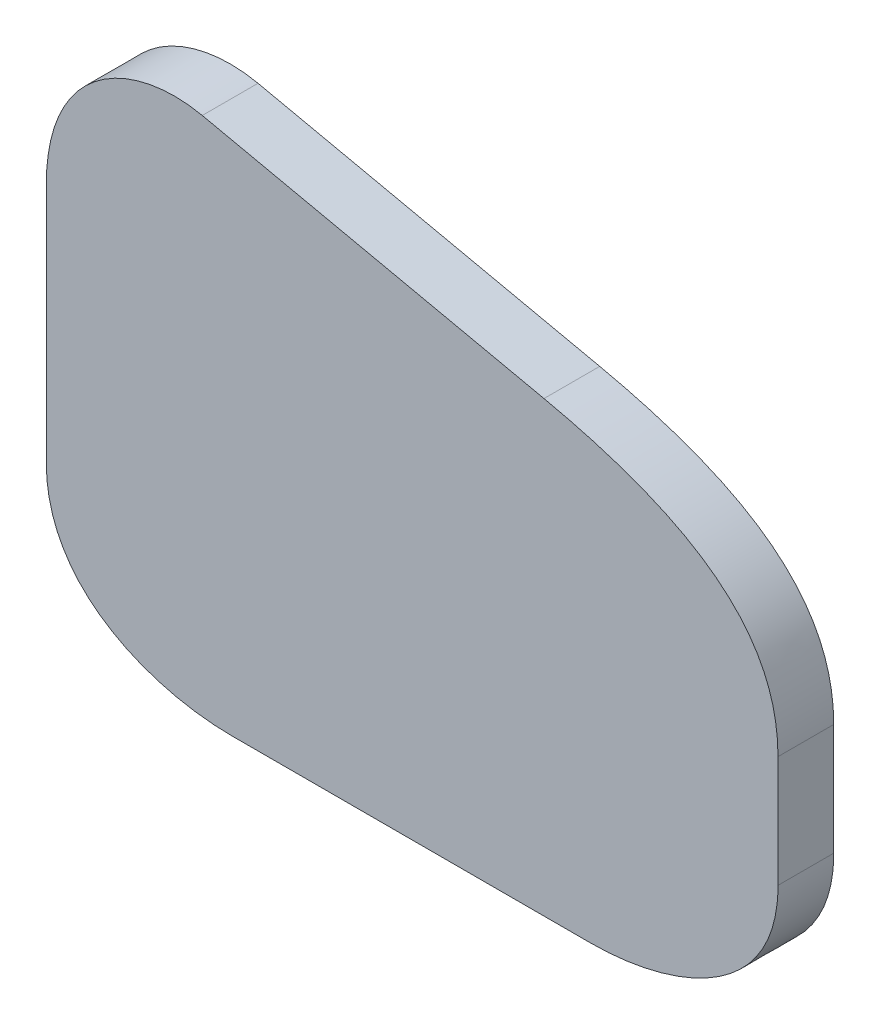
ISO-10303-21;
HEADER;
FILE_DESCRIPTION(('STEP AP214'),'2;1');
FILE_NAME('part.step','',(''),(''),'','','');
FILE_SCHEMA(('AUTOMOTIVE_DESIGN { 1 0 10303 214 1 1 1 1 }'));
ENDSEC;
DATA;
#1=APPLICATION_CONTEXT('core data for automotive mechanical design processes');
#2=APPLICATION_PROTOCOL_DEFINITION('international standard','automotive_design',2000,#1);
#3=PRODUCT_CONTEXT('',#1,'mechanical');
#4=PRODUCT('Part','Part','',(#3));
#5=PRODUCT_RELATED_PRODUCT_CATEGORY('part','',(#4));
#6=PRODUCT_DEFINITION_FORMATION('','',#4);
#7=PRODUCT_DEFINITION_CONTEXT('part definition',#1,'design');
#8=PRODUCT_DEFINITION('design','',#6,#7);
#9=PRODUCT_DEFINITION_SHAPE('','',#8);
#10=(LENGTH_UNIT() NAMED_UNIT(*) SI_UNIT(.MILLI.,.METRE.));
#11=(NAMED_UNIT(*) PLANE_ANGLE_UNIT() SI_UNIT($,.RADIAN.));
#12=(NAMED_UNIT(*) SI_UNIT($,.STERADIAN.) SOLID_ANGLE_UNIT());
#13=UNCERTAINTY_MEASURE_WITH_UNIT(LENGTH_MEASURE(1.E-05),#10,'distance_accuracy_value','');
#14=(GEOMETRIC_REPRESENTATION_CONTEXT(3) GLOBAL_UNCERTAINTY_ASSIGNED_CONTEXT((#13)) GLOBAL_UNIT_ASSIGNED_CONTEXT((#10,
#11,#12)) REPRESENTATION_CONTEXT('',''));
#15=CARTESIAN_POINT('',(0.,0.,0.));
#16=DIRECTION('',(0.,0.,1.));
#17=DIRECTION('',(1.,0.,0.));
#18=AXIS2_PLACEMENT_3D('',#15,#16,#17);
#19=CARTESIAN_POINT('',(-33.5451291028447,-25.7697680525164,10.));
#20=CARTESIAN_POINT('',(-19.4448665678301,-25.7697680525164,10.));
#21=CARTESIAN_POINT('',(0.,-19.0637574545764,10.));
#22=CARTESIAN_POINT('',(0.,0.,10.));
#23=B_SPLINE_CURVE_WITH_KNOTS('',3,(#19,#20,#21,#22),.UNSPECIFIED.,.F.,.F.,(4,4),(0.,1.),.UNSPECIFIED.);
#24=DIRECTION('',(0.,0.,-1.));
#25=VECTOR('',#24,1.);
#26=SURFACE_OF_LINEAR_EXTRUSION('',#23,#25);
#27=CARTESIAN_POINT('',(-33.5451291028447,-25.7697680525164,0.));
#28=CARTESIAN_POINT('',(-19.4448665678301,-25.7697680525164,0.));
#29=CARTESIAN_POINT('',(0.,-19.0637574545764,0.));
#30=CARTESIAN_POINT('',(0.,0.,0.));
#31=B_SPLINE_CURVE_WITH_KNOTS('',3,(#27,#28,#29,#30),.UNSPECIFIED.,.F.,.F.,(4,4),(0.,1.),.UNSPECIFIED.);
#32=CARTESIAN_POINT('',(-33.5451291028447,-25.7697680525164,0.));
#33=VERTEX_POINT('',#32);
#34=CARTESIAN_POINT('',(0.,0.,0.));
#35=VERTEX_POINT('',#34);
#36=EDGE_CURVE('E189',#33,#35,#31,.T.);
#37=ORIENTED_EDGE('',*,*,#36,.T.);
#38=DIRECTION('',(0.,0.,-1.));
#39=VECTOR('',#38,1.);
#40=CARTESIAN_POINT('',(0.,0.,10.));
#41=LINE('',#40,#39);
#42=CARTESIAN_POINT('',(0.,0.,10.));
#43=VERTEX_POINT('',#42);
#44=EDGE_CURVE('E11',#43,#35,#41,.T.);
#45=ORIENTED_EDGE('',*,*,#44,.F.);
#46=CARTESIAN_POINT('',(-33.5451291028447,-25.7697680525164,10.));
#47=VERTEX_POINT('',#46);
#48=EDGE_CURVE('E221',#47,#43,#23,.T.);
#49=ORIENTED_EDGE('',*,*,#48,.F.);
#50=DIRECTION('',(0.,0.,-1.));
#51=VECTOR('',#50,1.);
#52=CARTESIAN_POINT('',(-33.5451291028447,-25.7697680525164,10.));
#53=LINE('',#52,#51);
#54=EDGE_CURVE('E130',#47,#33,#53,.T.);
#55=ORIENTED_EDGE('',*,*,#54,.T.);
#56=EDGE_LOOP('',(#37,#45,#49,#55));
#57=FACE_BOUND('',#56,.T.);
#58=ADVANCED_FACE('F37',(#57),#26,.F.);
#59=CARTESIAN_POINT('',(0.,0.,10.));
#60=DIRECTION('',(-1.,0.,0.));
#61=DIRECTION('',(0.,0.,1.));
#62=AXIS2_PLACEMENT_3D('',#59,#60,#61);
#63=PLANE('',#62);
#64=DIRECTION('',(0.,1.,0.));
#65=VECTOR('',#64,1.);
#66=CARTESIAN_POINT('',(0.,0.,0.));
#67=LINE('',#66,#65);
#68=CARTESIAN_POINT('',(0.,20.,0.));
#69=VERTEX_POINT('',#68);
#70=EDGE_CURVE('E180',#35,#69,#67,.T.);
#71=ORIENTED_EDGE('',*,*,#70,.T.);
#72=DIRECTION('',(0.,0.,-1.));
#73=VECTOR('',#72,1.);
#74=CARTESIAN_POINT('',(0.,20.,10.));
#75=LINE('',#74,#73);
#76=CARTESIAN_POINT('',(0.,20.,10.));
#77=VERTEX_POINT('',#76);
#78=EDGE_CURVE('E46',#77,#69,#75,.T.);
#79=ORIENTED_EDGE('',*,*,#78,.F.);
#80=DIRECTION('',(0.,1.,0.));
#81=VECTOR('',#80,1.);
#82=CARTESIAN_POINT('',(0.,0.,10.));
#83=LINE('',#82,#81);
#84=EDGE_CURVE('E97',#43,#77,#83,.T.);
#85=ORIENTED_EDGE('',*,*,#84,.F.);
#86=ORIENTED_EDGE('',*,*,#44,.T.);
#87=EDGE_LOOP('',(#71,#79,#85,#86));
#88=FACE_BOUND('',#87,.T.);
#89=ADVANCED_FACE('F173',(#88),#63,.F.);
#90=CARTESIAN_POINT('',(0.,20.,10.));
#91=CARTESIAN_POINT('',(0.,38.1460258986672,10.));
#92=CARTESIAN_POINT('',(-14.2094741821754,48.6110988969908,10.));
#93=CARTESIAN_POINT('',(-41.9869496717725,54.6496805251641,10.));
#94=B_SPLINE_CURVE_WITH_KNOTS('',3,(#90,#91,#92,#93),.UNSPECIFIED.,.F.,.F.,(4,4),(0.,1.),.UNSPECIFIED.);
#95=DIRECTION('',(0.,0.,-1.));
#96=VECTOR('',#95,1.);
#97=SURFACE_OF_LINEAR_EXTRUSION('',#94,#96);
#98=CARTESIAN_POINT('',(0.,20.,0.));
#99=CARTESIAN_POINT('',(0.,38.1460258986672,0.));
#100=CARTESIAN_POINT('',(-14.2094741821754,48.6110988969908,0.));
#101=CARTESIAN_POINT('',(-41.9869496717725,54.6496805251641,0.));
#102=B_SPLINE_CURVE_WITH_KNOTS('',3,(#98,#99,#100,#101),.UNSPECIFIED.,.F.,.F.,(4,4),(0.,1.),.UNSPECIFIED.);
#103=CARTESIAN_POINT('',(-41.9869496717725,54.6496805251641,0.));
#104=VERTEX_POINT('',#103);
#105=EDGE_CURVE('E188',#69,#104,#102,.T.);
#106=ORIENTED_EDGE('',*,*,#105,.T.);
#107=DIRECTION('',(0.,0.,-1.));
#108=VECTOR('',#107,1.);
#109=CARTESIAN_POINT('',(-41.9869496717725,54.6496805251641,10.));
#110=LINE('',#109,#108);
#111=CARTESIAN_POINT('',(-41.9869496717725,54.6496805251641,10.));
#112=VERTEX_POINT('',#111);
#113=EDGE_CURVE('E193',#112,#104,#110,.T.);
#114=ORIENTED_EDGE('',*,*,#113,.F.);
#115=EDGE_CURVE('E163',#77,#112,#94,.T.);
#116=ORIENTED_EDGE('',*,*,#115,.F.);
#117=ORIENTED_EDGE('',*,*,#78,.T.);
#118=EDGE_LOOP('',(#106,#114,#116,#117));
#119=FACE_BOUND('',#118,.T.);
#120=ADVANCED_FACE('F171',(#119),#97,.F.);
#121=CARTESIAN_POINT('',(-41.9869496717725,54.6496805251641,10.));
#122=DIRECTION('',(-0.212429644331044,-0.977176363922801,0.));
#123=DIRECTION('',(0.977176363922801,-0.212429644331044,0.));
#124=AXIS2_PLACEMENT_3D('',#121,#122,#123);
#125=PLANE('',#124);
#126=DIRECTION('',(-0.977176363922801,0.212429644331044,0.));
#127=VECTOR('',#126,1.);
#128=CARTESIAN_POINT('',(-41.9869496717725,54.6496805251641,0.));
#129=LINE('',#128,#127);
#130=CARTESIAN_POINT('',(-103.301225382932,67.9788708971554,0.));
#131=VERTEX_POINT('',#130);
#132=EDGE_CURVE('E197',#104,#131,#129,.T.);
#133=ORIENTED_EDGE('',*,*,#132,.T.);
#134=DIRECTION('',(0.,0.,-1.));
#135=VECTOR('',#134,1.);
#136=CARTESIAN_POINT('',(-103.301225382932,67.9788708971554,10.));
#137=LINE('',#136,#135);
#138=CARTESIAN_POINT('',(-103.301225382932,67.9788708971554,10.));
#139=VERTEX_POINT('',#138);
#140=EDGE_CURVE('E225',#139,#131,#137,.T.);
#141=ORIENTED_EDGE('',*,*,#140,.F.);
#142=DIRECTION('',(-0.977176363922801,0.212429644331044,0.));
#143=VECTOR('',#142,1.);
#144=CARTESIAN_POINT('',(-41.9869496717725,54.6496805251641,10.));
#145=LINE('',#144,#143);
#146=EDGE_CURVE('E158',#112,#139,#145,.T.);
#147=ORIENTED_EDGE('',*,*,#146,.F.);
#148=ORIENTED_EDGE('',*,*,#113,.T.);
#149=EDGE_LOOP('',(#133,#141,#147,#148));
#150=FACE_BOUND('',#149,.T.);
#151=ADVANCED_FACE('F151',(#150),#125,.F.);
#152=CARTESIAN_POINT('',(-103.301225382932,67.9788708971554,10.));
#153=CARTESIAN_POINT('',(-115.500001367253,70.6307787198339,10.));
#154=CARTESIAN_POINT('',(-131.292525164114,63.3933061839038,10.));
#155=CARTESIAN_POINT('',(-131.292525164114,43.097715536105,10.));
#156=B_SPLINE_CURVE_WITH_KNOTS('',3,(#152,#153,#154,#155),.UNSPECIFIED.,.F.,.F.,(4,4),(0.,1.),.UNSPECIFIED.);
#157=DIRECTION('',(0.,0.,-1.));
#158=VECTOR('',#157,1.);
#159=SURFACE_OF_LINEAR_EXTRUSION('',#156,#158);
#160=CARTESIAN_POINT('',(-103.301225382932,67.9788708971554,0.));
#161=CARTESIAN_POINT('',(-115.500001367253,70.6307787198339,0.));
#162=CARTESIAN_POINT('',(-131.292525164114,63.3933061839038,0.));
#163=CARTESIAN_POINT('',(-131.292525164114,43.097715536105,0.));
#164=B_SPLINE_CURVE_WITH_KNOTS('',3,(#160,#161,#162,#163),.UNSPECIFIED.,.F.,.F.,(4,4),(0.,1.),.UNSPECIFIED.);
#165=CARTESIAN_POINT('',(-131.292525164114,43.097715536105,0.));
#166=VERTEX_POINT('',#165);
#167=EDGE_CURVE('E199',#131,#166,#164,.T.);
#168=ORIENTED_EDGE('',*,*,#167,.T.);
#169=DIRECTION('',(0.,0.,-1.));
#170=VECTOR('',#169,1.);
#171=CARTESIAN_POINT('',(-131.292525164114,43.097715536105,10.));
#172=LINE('',#171,#170);
#173=CARTESIAN_POINT('',(-131.292525164114,43.097715536105,10.));
#174=VERTEX_POINT('',#173);
#175=EDGE_CURVE('E125',#174,#166,#172,.T.);
#176=ORIENTED_EDGE('',*,*,#175,.F.);
#177=EDGE_CURVE('E116',#139,#174,#156,.T.);
#178=ORIENTED_EDGE('',*,*,#177,.F.);
#179=ORIENTED_EDGE('',*,*,#140,.T.);
#180=EDGE_LOOP('',(#168,#176,#178,#179));
#181=FACE_BOUND('',#180,.T.);
#182=ADVANCED_FACE('F148',(#181),#159,.F.);
#183=CARTESIAN_POINT('',(-131.292525164114,43.097715536105,10.));
#184=DIRECTION('',(1.,0.,0.));
#185=DIRECTION('',(0.,0.,-1.));
#186=AXIS2_PLACEMENT_3D('',#183,#184,#185);
#187=PLANE('',#186);
#188=DIRECTION('',(0.,-1.,0.));
#189=VECTOR('',#188,1.);
#190=CARTESIAN_POINT('',(-131.292525164114,43.097715536105,0.));
#191=LINE('',#190,#189);
#192=CARTESIAN_POINT('',(-131.292525164114,0.,0.));
#193=VERTEX_POINT('',#192);
#194=EDGE_CURVE('E124',#166,#193,#191,.T.);
#195=ORIENTED_EDGE('',*,*,#194,.T.);
#196=DIRECTION('',(0.,0.,-1.));
#197=VECTOR('',#196,1.);
#198=CARTESIAN_POINT('',(-131.292525164114,0.,10.));
#199=LINE('',#198,#197);
#200=CARTESIAN_POINT('',(-131.292525164114,0.,10.));
#201=VERTEX_POINT('',#200);
#202=EDGE_CURVE('E121',#201,#193,#199,.T.);
#203=ORIENTED_EDGE('',*,*,#202,.F.);
#204=DIRECTION('',(0.,-1.,0.));
#205=VECTOR('',#204,1.);
#206=CARTESIAN_POINT('',(-131.292525164114,43.097715536105,10.));
#207=LINE('',#206,#205);
#208=EDGE_CURVE('E110',#174,#201,#207,.T.);
#209=ORIENTED_EDGE('',*,*,#208,.F.);
#210=ORIENTED_EDGE('',*,*,#175,.T.);
#211=EDGE_LOOP('',(#195,#203,#209,#210));
#212=FACE_BOUND('',#211,.T.);
#213=ADVANCED_FACE('F122',(#212),#187,.F.);
#214=CARTESIAN_POINT('',(-131.292525164114,0.,10.));
#215=CARTESIAN_POINT('',(-131.292525164114,-19.0251558180361,10.));
#216=CARTESIAN_POINT('',(-112.011160689261,-25.7697680525164,10.));
#217=CARTESIAN_POINT('',(-97.9695492341357,-25.7697680525164,10.));
#218=B_SPLINE_CURVE_WITH_KNOTS('',3,(#214,#215,#216,#217),.UNSPECIFIED.,.F.,.F.,(4,4),(0.,1.),.UNSPECIFIED.);
#219=DIRECTION('',(0.,0.,-1.));
#220=VECTOR('',#219,1.);
#221=SURFACE_OF_LINEAR_EXTRUSION('',#218,#220);
#222=CARTESIAN_POINT('',(-131.292525164114,0.,0.));
#223=CARTESIAN_POINT('',(-131.292525164114,-19.0251558180361,0.));
#224=CARTESIAN_POINT('',(-112.011160689261,-25.7697680525164,0.));
#225=CARTESIAN_POINT('',(-97.9695492341357,-25.7697680525164,0.));
#226=B_SPLINE_CURVE_WITH_KNOTS('',3,(#222,#223,#224,#225),.UNSPECIFIED.,.F.,.F.,(4,4),(0.,1.),.UNSPECIFIED.);
#227=CARTESIAN_POINT('',(-97.9695492341357,-25.7697680525164,0.));
#228=VERTEX_POINT('',#227);
#229=EDGE_CURVE('E83',#193,#228,#226,.T.);
#230=ORIENTED_EDGE('',*,*,#229,.T.);
#231=DIRECTION('',(0.,0.,-1.));
#232=VECTOR('',#231,1.);
#233=CARTESIAN_POINT('',(-97.9695492341357,-25.7697680525164,10.));
#234=LINE('',#233,#232);
#235=CARTESIAN_POINT('',(-97.9695492341357,-25.7697680525164,10.));
#236=VERTEX_POINT('',#235);
#237=EDGE_CURVE('E126',#236,#228,#234,.T.);
#238=ORIENTED_EDGE('',*,*,#237,.F.);
#239=EDGE_CURVE('E114',#201,#236,#218,.T.);
#240=ORIENTED_EDGE('',*,*,#239,.F.);
#241=ORIENTED_EDGE('',*,*,#202,.T.);
#242=EDGE_LOOP('',(#230,#238,#240,#241));
#243=FACE_BOUND('',#242,.T.);
#244=ADVANCED_FACE('F128',(#243),#221,.F.);
#245=CARTESIAN_POINT('',(-33.5451291028447,-25.7697680525164,10.));
#246=DIRECTION('',(0.,1.,0.));
#247=DIRECTION('',(0.,0.,1.));
#248=AXIS2_PLACEMENT_3D('',#245,#246,#247);
#249=PLANE('',#248);
#250=DIRECTION('',(1.,0.,0.));
#251=VECTOR('',#250,1.);
#252=CARTESIAN_POINT('',(-33.5451291028447,-25.7697680525164,0.));
#253=LINE('',#252,#251);
#254=EDGE_CURVE('E89',#228,#33,#253,.T.);
#255=ORIENTED_EDGE('',*,*,#254,.T.);
#256=ORIENTED_EDGE('',*,*,#54,.F.);
#257=DIRECTION('',(1.,0.,0.));
#258=VECTOR('',#257,1.);
#259=CARTESIAN_POINT('',(-33.5451291028447,-25.7697680525164,10.));
#260=LINE('',#259,#258);
#261=EDGE_CURVE('E54',#236,#47,#260,.T.);
#262=ORIENTED_EDGE('',*,*,#261,.F.);
#263=ORIENTED_EDGE('',*,*,#237,.T.);
#264=EDGE_LOOP('',(#255,#256,#262,#263));
#265=FACE_BOUND('',#264,.T.);
#266=ADVANCED_FACE('F144',(#265),#249,.F.);
#267=CARTESIAN_POINT('',(-11.4849661007919,-20.0337930717244,10.));
#268=DIRECTION('',(0.,0.,-1.));
#269=DIRECTION('',(-1.,0.,0.));
#270=AXIS2_PLACEMENT_3D('',#267,#268,#269);
#271=PLANE('',#270);
#272=ORIENTED_EDGE('',*,*,#48,.T.);
#273=ORIENTED_EDGE('',*,*,#84,.T.);
#274=ORIENTED_EDGE('',*,*,#115,.T.);
#275=ORIENTED_EDGE('',*,*,#146,.T.);
#276=ORIENTED_EDGE('',*,*,#177,.T.);
#277=ORIENTED_EDGE('',*,*,#208,.T.);
#278=ORIENTED_EDGE('',*,*,#239,.T.);
#279=ORIENTED_EDGE('',*,*,#261,.T.);
#280=EDGE_LOOP('',(#272,#273,#274,#275,#276,#277,#278,#279));
#281=FACE_BOUND('',#280,.T.);
#282=ADVANCED_FACE('F112',(#281),#271,.F.);
#283=CARTESIAN_POINT('',(-11.4849661007919,-20.0337930717244,0.));
#284=DIRECTION('',(0.,0.,-1.));
#285=DIRECTION('',(-1.,0.,0.));
#286=AXIS2_PLACEMENT_3D('',#283,#284,#285);
#287=PLANE('',#286);
#288=ORIENTED_EDGE('',*,*,#36,.F.);
#289=ORIENTED_EDGE('',*,*,#254,.F.);
#290=ORIENTED_EDGE('',*,*,#229,.F.);
#291=ORIENTED_EDGE('',*,*,#194,.F.);
#292=ORIENTED_EDGE('',*,*,#167,.F.);
#293=ORIENTED_EDGE('',*,*,#132,.F.);
#294=ORIENTED_EDGE('',*,*,#105,.F.);
#295=ORIENTED_EDGE('',*,*,#70,.F.);
#296=EDGE_LOOP('',(#288,#289,#290,#291,#292,#293,#294,#295));
#297=FACE_BOUND('',#296,.T.);
#298=ADVANCED_FACE('F195',(#297),#287,.T.);
#299=CLOSED_SHELL('',(#58,#89,#120,#151,#182,#213,#244,#266,#282,#298));
#300=MANIFOLD_SOLID_BREP('B2',#299);
#301=ADVANCED_BREP_SHAPE_REPRESENTATION('',(#18,#300),#14);
#302=SHAPE_DEFINITION_REPRESENTATION(#9,#301);
ENDSEC;
END-ISO-10303-21;
